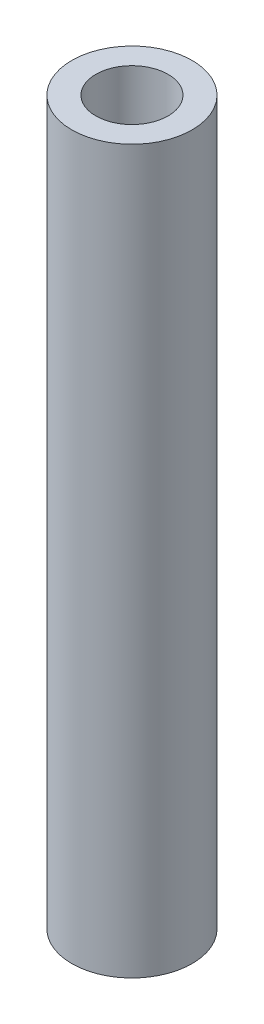
ISO-10303-21;
HEADER;
FILE_DESCRIPTION(('STEP AP214'),'2;1');
FILE_NAME('part.step','',(''),(''),'','','');
FILE_SCHEMA(('AUTOMOTIVE_DESIGN { 1 0 10303 214 1 1 1 1 }'));
ENDSEC;
DATA;
#1=APPLICATION_CONTEXT('core data for automotive mechanical design processes');
#2=APPLICATION_PROTOCOL_DEFINITION('international standard','automotive_design',2000,#1);
#3=PRODUCT_CONTEXT('',#1,'mechanical');
#4=PRODUCT('Part','Part','',(#3));
#5=PRODUCT_RELATED_PRODUCT_CATEGORY('part','',(#4));
#6=PRODUCT_DEFINITION_FORMATION('','',#4);
#7=PRODUCT_DEFINITION_CONTEXT('part definition',#1,'design');
#8=PRODUCT_DEFINITION('design','',#6,#7);
#9=PRODUCT_DEFINITION_SHAPE('','',#8);
#10=(LENGTH_UNIT() NAMED_UNIT(*) SI_UNIT(.MILLI.,.METRE.));
#11=(NAMED_UNIT(*) PLANE_ANGLE_UNIT() SI_UNIT($,.RADIAN.));
#12=(NAMED_UNIT(*) SI_UNIT($,.STERADIAN.) SOLID_ANGLE_UNIT());
#13=UNCERTAINTY_MEASURE_WITH_UNIT(LENGTH_MEASURE(1.E-05),#10,'distance_accuracy_value','');
#14=(GEOMETRIC_REPRESENTATION_CONTEXT(3) GLOBAL_UNCERTAINTY_ASSIGNED_CONTEXT((#13)) GLOBAL_UNIT_ASSIGNED_CONTEXT((#10,
#11,#12)) REPRESENTATION_CONTEXT('',''));
#15=CARTESIAN_POINT('',(0.,0.,0.));
#16=DIRECTION('',(0.,0.,1.));
#17=DIRECTION('',(1.,0.,0.));
#18=AXIS2_PLACEMENT_3D('',#15,#16,#17);
#19=CARTESIAN_POINT('',(0.,30.,0.));
#20=DIRECTION('',(0.,1.,0.));
#21=DIRECTION('',(0.,0.,1.));
#22=AXIS2_PLACEMENT_3D('',#19,#20,#21);
#23=PLANE('',#22);
#24=CARTESIAN_POINT('',(0.,30.,0.));
#25=DIRECTION('',(0.,1.,0.));
#26=DIRECTION('',(0.,0.,1.));
#27=AXIS2_PLACEMENT_3D('',#24,#25,#26);
#28=CIRCLE('',#27,2.5);
#29=CARTESIAN_POINT('',(0.,30.,2.5));
#30=VERTEX_POINT('',#29);
#31=EDGE_CURVE('E10',#30,#30,#28,.T.);
#32=ORIENTED_EDGE('',*,*,#31,.T.);
#33=EDGE_LOOP('',(#32));
#34=FACE_BOUND('',#33,.T.);
#35=CARTESIAN_POINT('',(0.,30.,0.));
#36=DIRECTION('',(0.,1.,0.));
#37=DIRECTION('',(0.,0.,1.));
#38=AXIS2_PLACEMENT_3D('',#35,#36,#37);
#39=CIRCLE('',#38,1.5);
#40=CARTESIAN_POINT('',(0.,30.,1.5));
#41=VERTEX_POINT('',#40);
#42=EDGE_CURVE('E54',#41,#41,#39,.T.);
#43=ORIENTED_EDGE('',*,*,#42,.F.);
#44=EDGE_LOOP('',(#43));
#45=FACE_BOUND('',#44,.T.);
#46=ADVANCED_FACE('F41',(#34,#45),#23,.T.);
#47=CARTESIAN_POINT('',(0.,0.,0.));
#48=DIRECTION('',(0.,1.,0.));
#49=DIRECTION('',(0.,0.,1.));
#50=AXIS2_PLACEMENT_3D('',#47,#48,#49);
#51=PLANE('',#50);
#52=CARTESIAN_POINT('',(0.,0.,0.));
#53=DIRECTION('',(0.,1.,0.));
#54=DIRECTION('',(0.,0.,1.));
#55=AXIS2_PLACEMENT_3D('',#52,#53,#54);
#56=CIRCLE('',#55,2.5);
#57=CARTESIAN_POINT('',(0.,0.,2.5));
#58=VERTEX_POINT('',#57);
#59=EDGE_CURVE('E45',#58,#58,#56,.T.);
#60=ORIENTED_EDGE('',*,*,#59,.F.);
#61=EDGE_LOOP('',(#60));
#62=FACE_BOUND('',#61,.T.);
#63=CARTESIAN_POINT('',(0.,0.,0.));
#64=DIRECTION('',(0.,1.,0.));
#65=DIRECTION('',(0.,0.,1.));
#66=AXIS2_PLACEMENT_3D('',#63,#64,#65);
#67=CIRCLE('',#66,1.5);
#68=CARTESIAN_POINT('',(0.,0.,1.5));
#69=VERTEX_POINT('',#68);
#70=EDGE_CURVE('E56',#69,#69,#67,.T.);
#71=ORIENTED_EDGE('',*,*,#70,.T.);
#72=EDGE_LOOP('',(#71));
#73=FACE_BOUND('',#72,.T.);
#74=ADVANCED_FACE('F68',(#62,#73),#51,.F.);
#75=CARTESIAN_POINT('',(0.,30.,0.));
#76=DIRECTION('',(0.,-1.,0.));
#77=DIRECTION('',(0.,0.,-1.));
#78=AXIS2_PLACEMENT_3D('',#75,#76,#77);
#79=CYLINDRICAL_SURFACE('',#78,2.5);
#80=ORIENTED_EDGE('',*,*,#31,.F.);
#81=EDGE_LOOP('',(#80));
#82=FACE_BOUND('',#81,.T.);
#83=ORIENTED_EDGE('',*,*,#59,.T.);
#84=EDGE_LOOP('',(#83));
#85=FACE_BOUND('',#84,.T.);
#86=ADVANCED_FACE('F43',(#82,#85),#79,.T.);
#87=CARTESIAN_POINT('',(0.,30.,0.));
#88=DIRECTION('',(0.,-1.,0.));
#89=DIRECTION('',(0.,0.,-1.));
#90=AXIS2_PLACEMENT_3D('',#87,#88,#89);
#91=CYLINDRICAL_SURFACE('',#90,1.5);
#92=ORIENTED_EDGE('',*,*,#42,.T.);
#93=EDGE_LOOP('',(#92));
#94=FACE_BOUND('',#93,.T.);
#95=ORIENTED_EDGE('',*,*,#70,.F.);
#96=EDGE_LOOP('',(#95));
#97=FACE_BOUND('',#96,.T.);
#98=ADVANCED_FACE('F64',(#94,#97),#91,.F.);
#99=CLOSED_SHELL('',(#46,#74,#86,#98));
#100=MANIFOLD_SOLID_BREP('B2',#99);
#101=ADVANCED_BREP_SHAPE_REPRESENTATION('',(#18,#100),#14);
#102=SHAPE_DEFINITION_REPRESENTATION(#9,#101);
ENDSEC;
END-ISO-10303-21;
